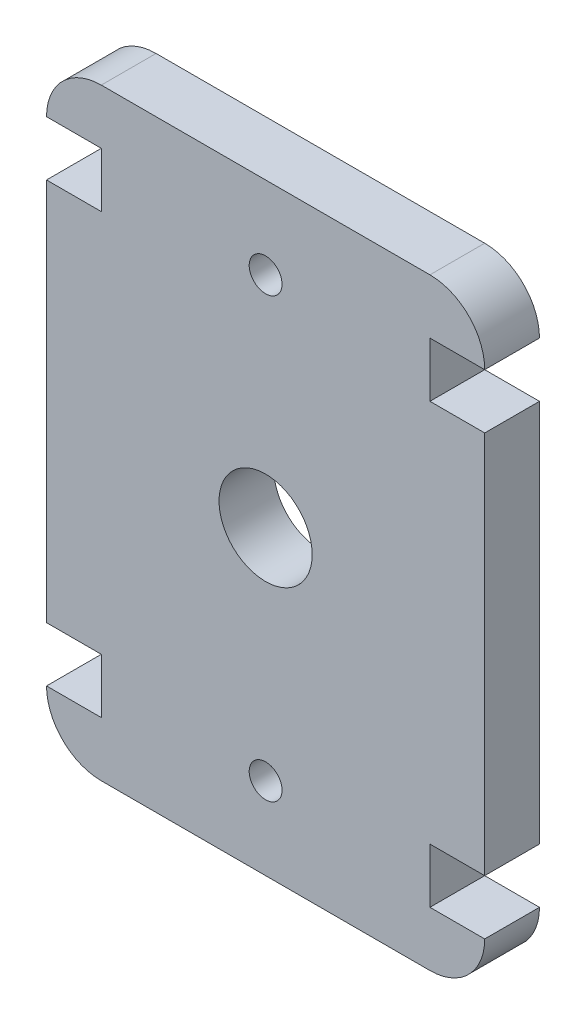
ISO-10303-21;
HEADER;
FILE_DESCRIPTION(('STEP AP214'),'2;1');
FILE_NAME('part.step','',(''),(''),'','','');
FILE_SCHEMA(('AUTOMOTIVE_DESIGN { 1 0 10303 214 1 1 1 1 }'));
ENDSEC;
DATA;
#1=APPLICATION_CONTEXT('core data for automotive mechanical design processes');
#2=APPLICATION_PROTOCOL_DEFINITION('international standard','automotive_design',2000,#1);
#3=PRODUCT_CONTEXT('',#1,'mechanical');
#4=PRODUCT('Part','Part','',(#3));
#5=PRODUCT_RELATED_PRODUCT_CATEGORY('part','',(#4));
#6=PRODUCT_DEFINITION_FORMATION('','',#4);
#7=PRODUCT_DEFINITION_CONTEXT('part definition',#1,'design');
#8=PRODUCT_DEFINITION('design','',#6,#7);
#9=PRODUCT_DEFINITION_SHAPE('','',#8);
#10=(LENGTH_UNIT() NAMED_UNIT(*) SI_UNIT(.MILLI.,.METRE.));
#11=(NAMED_UNIT(*) PLANE_ANGLE_UNIT() SI_UNIT($,.RADIAN.));
#12=(NAMED_UNIT(*) SI_UNIT($,.STERADIAN.) SOLID_ANGLE_UNIT());
#13=UNCERTAINTY_MEASURE_WITH_UNIT(LENGTH_MEASURE(1.E-05),#10,'distance_accuracy_value','');
#14=(GEOMETRIC_REPRESENTATION_CONTEXT(3) GLOBAL_UNCERTAINTY_ASSIGNED_CONTEXT((#13)) GLOBAL_UNIT_ASSIGNED_CONTEXT((#10,
#11,#12)) REPRESENTATION_CONTEXT('',''));
#15=CARTESIAN_POINT('',(0.,0.,0.));
#16=DIRECTION('',(0.,0.,1.));
#17=DIRECTION('',(1.,0.,0.));
#18=AXIS2_PLACEMENT_3D('',#15,#16,#17);
#19=CARTESIAN_POINT('',(0.,0.,5.));
#20=DIRECTION('',(0.,0.,1.));
#21=DIRECTION('',(1.,0.,0.));
#22=AXIS2_PLACEMENT_3D('',#19,#20,#21);
#23=PLANE('',#22);
#24=CARTESIAN_POINT('',(0.,7.5,5.));
#25=DIRECTION('',(0.,0.,1.));
#26=DIRECTION('',(1.,0.,0.));
#27=AXIS2_PLACEMENT_3D('',#24,#25,#26);
#28=CIRCLE('',#27,1.5);
#29=CARTESIAN_POINT('',(1.5,7.5,5.));
#30=VERTEX_POINT('',#29);
#31=EDGE_CURVE('E473',#30,#30,#28,.T.);
#32=ORIENTED_EDGE('',*,*,#31,.F.);
#33=EDGE_LOOP('',(#32));
#34=FACE_BOUND('',#33,.T.);
#35=DIRECTION('',(1.,0.,0.));
#36=VECTOR('',#35,1.);
#37=CARTESIAN_POINT('',(15.,50.,5.));
#38=LINE('',#37,#36);
#39=CARTESIAN_POINT('',(15.,50.,5.));
#40=VERTEX_POINT('',#39);
#41=CARTESIAN_POINT('',(20.,50.,5.));
#42=VERTEX_POINT('',#41);
#43=EDGE_CURVE('E325',#40,#42,#38,.T.);
#44=ORIENTED_EDGE('',*,*,#43,.T.);
#45=CARTESIAN_POINT('',(15.,50.0000000000001,5.));
#46=DIRECTION('',(0.,0.,1.));
#47=DIRECTION('',(1.,0.,0.));
#48=AXIS2_PLACEMENT_3D('',#45,#46,#47);
#49=CIRCLE('',#48,5.);
#50=CARTESIAN_POINT('',(15.,55.0000000000001,5.));
#51=VERTEX_POINT('',#50);
#52=EDGE_CURVE('E174',#42,#51,#49,.T.);
#53=ORIENTED_EDGE('',*,*,#52,.T.);
#54=DIRECTION('',(-1.,0.,0.));
#55=VECTOR('',#54,1.);
#56=CARTESIAN_POINT('',(20.,55.0000000000001,5.));
#57=LINE('',#56,#55);
#58=CARTESIAN_POINT('',(-15.,55.0000000000001,5.));
#59=VERTEX_POINT('',#58);
#60=EDGE_CURVE('E331',#51,#59,#57,.T.);
#61=ORIENTED_EDGE('',*,*,#60,.T.);
#62=CARTESIAN_POINT('',(-15.,50.0000000000001,5.));
#63=DIRECTION('',(0.,0.,1.));
#64=DIRECTION('',(1.,0.,0.));
#65=AXIS2_PLACEMENT_3D('',#62,#63,#64);
#66=CIRCLE('',#65,5.);
#67=CARTESIAN_POINT('',(-20.,50.,5.));
#68=VERTEX_POINT('',#67);
#69=EDGE_CURVE('E205',#59,#68,#66,.T.);
#70=ORIENTED_EDGE('',*,*,#69,.T.);
#71=DIRECTION('',(1.,0.,0.));
#72=VECTOR('',#71,1.);
#73=CARTESIAN_POINT('',(-20.,50.,5.));
#74=LINE('',#73,#72);
#75=CARTESIAN_POINT('',(-15.,50.,5.));
#76=VERTEX_POINT('',#75);
#77=EDGE_CURVE('E334',#68,#76,#74,.T.);
#78=ORIENTED_EDGE('',*,*,#77,.T.);
#79=DIRECTION('',(0.,-1.,0.));
#80=VECTOR('',#79,1.);
#81=CARTESIAN_POINT('',(-15.,50.,5.));
#82=LINE('',#81,#80);
#83=CARTESIAN_POINT('',(-15.,45.,5.));
#84=VERTEX_POINT('',#83);
#85=EDGE_CURVE('E336',#76,#84,#82,.T.);
#86=ORIENTED_EDGE('',*,*,#85,.T.);
#87=DIRECTION('',(-1.,0.,0.));
#88=VECTOR('',#87,1.);
#89=CARTESIAN_POINT('',(-15.,45.,5.));
#90=LINE('',#89,#88);
#91=CARTESIAN_POINT('',(-20.,45.,5.));
#92=VERTEX_POINT('',#91);
#93=EDGE_CURVE('E338',#84,#92,#90,.T.);
#94=ORIENTED_EDGE('',*,*,#93,.T.);
#95=DIRECTION('',(0.,-1.,0.));
#96=VECTOR('',#95,1.);
#97=CARTESIAN_POINT('',(-20.,45.,5.));
#98=LINE('',#97,#96);
#99=CARTESIAN_POINT('',(-20.,10.0000000000001,5.));
#100=VERTEX_POINT('',#99);
#101=EDGE_CURVE('E340',#92,#100,#98,.T.);
#102=ORIENTED_EDGE('',*,*,#101,.T.);
#103=DIRECTION('',(1.,0.,0.));
#104=VECTOR('',#103,1.);
#105=CARTESIAN_POINT('',(-20.,10.0000000000001,5.));
#106=LINE('',#105,#104);
#107=CARTESIAN_POINT('',(-15.,10.,5.));
#108=VERTEX_POINT('',#107);
#109=EDGE_CURVE('E342',#100,#108,#106,.T.);
#110=ORIENTED_EDGE('',*,*,#109,.T.);
#111=DIRECTION('',(0.,-1.,0.));
#112=VECTOR('',#111,1.);
#113=CARTESIAN_POINT('',(-15.,10.,5.));
#114=LINE('',#113,#112);
#115=CARTESIAN_POINT('',(-15.,5.,5.));
#116=VERTEX_POINT('',#115);
#117=EDGE_CURVE('E343',#108,#116,#114,.T.);
#118=ORIENTED_EDGE('',*,*,#117,.T.);
#119=DIRECTION('',(-1.,0.,0.));
#120=VECTOR('',#119,1.);
#121=CARTESIAN_POINT('',(-15.,5.,5.));
#122=LINE('',#121,#120);
#123=CARTESIAN_POINT('',(-20.,5.00000000000009,5.));
#124=VERTEX_POINT('',#123);
#125=EDGE_CURVE('E229',#116,#124,#122,.T.);
#126=ORIENTED_EDGE('',*,*,#125,.T.);
#127=CARTESIAN_POINT('',(-15.,5.,5.));
#128=DIRECTION('',(0.,0.,1.));
#129=DIRECTION('',(1.,0.,0.));
#130=AXIS2_PLACEMENT_3D('',#127,#128,#129);
#131=CIRCLE('',#130,5.);
#132=CARTESIAN_POINT('',(-15.,0.,5.));
#133=VERTEX_POINT('',#132);
#134=EDGE_CURVE('E52',#124,#133,#131,.T.);
#135=ORIENTED_EDGE('',*,*,#134,.T.);
#136=DIRECTION('',(1.,0.,0.));
#137=VECTOR('',#136,1.);
#138=CARTESIAN_POINT('',(-20.,0.,5.));
#139=LINE('',#138,#137);
#140=CARTESIAN_POINT('',(15.,0.,5.));
#141=VERTEX_POINT('',#140);
#142=EDGE_CURVE('E171',#133,#141,#139,.T.);
#143=ORIENTED_EDGE('',*,*,#142,.T.);
#144=CARTESIAN_POINT('',(15.,5.,5.));
#145=DIRECTION('',(0.,0.,1.));
#146=DIRECTION('',(1.,0.,0.));
#147=AXIS2_PLACEMENT_3D('',#144,#145,#146);
#148=CIRCLE('',#147,5.);
#149=CARTESIAN_POINT('',(20.,5.0000000000001,5.));
#150=VERTEX_POINT('',#149);
#151=EDGE_CURVE('E166',#141,#150,#148,.T.);
#152=ORIENTED_EDGE('',*,*,#151,.T.);
#153=DIRECTION('',(-1.,0.,0.));
#154=VECTOR('',#153,1.);
#155=CARTESIAN_POINT('',(20.,5.0000000000001,5.));
#156=LINE('',#155,#154);
#157=CARTESIAN_POINT('',(15.,5.,5.));
#158=VERTEX_POINT('',#157);
#159=EDGE_CURVE('E169',#150,#158,#156,.T.);
#160=ORIENTED_EDGE('',*,*,#159,.T.);
#161=DIRECTION('',(0.,1.,0.));
#162=VECTOR('',#161,1.);
#163=CARTESIAN_POINT('',(15.,5.,5.));
#164=LINE('',#163,#162);
#165=CARTESIAN_POINT('',(15.,10.,5.));
#166=VERTEX_POINT('',#165);
#167=EDGE_CURVE('E184',#158,#166,#164,.T.);
#168=ORIENTED_EDGE('',*,*,#167,.T.);
#169=DIRECTION('',(1.,0.,0.));
#170=VECTOR('',#169,1.);
#171=CARTESIAN_POINT('',(15.,10.,5.));
#172=LINE('',#171,#170);
#173=CARTESIAN_POINT('',(20.,10.0000000000001,5.));
#174=VERTEX_POINT('',#173);
#175=EDGE_CURVE('E306',#166,#174,#172,.T.);
#176=ORIENTED_EDGE('',*,*,#175,.T.);
#177=DIRECTION('',(0.,1.,0.));
#178=VECTOR('',#177,1.);
#179=CARTESIAN_POINT('',(20.,10.0000000000001,5.));
#180=LINE('',#179,#178);
#181=CARTESIAN_POINT('',(20.,45.,5.));
#182=VERTEX_POINT('',#181);
#183=EDGE_CURVE('E323',#174,#182,#180,.T.);
#184=ORIENTED_EDGE('',*,*,#183,.T.);
#185=DIRECTION('',(-1.,0.,0.));
#186=VECTOR('',#185,1.);
#187=CARTESIAN_POINT('',(20.,45.,5.));
#188=LINE('',#187,#186);
#189=CARTESIAN_POINT('',(15.,45.,5.));
#190=VERTEX_POINT('',#189);
#191=EDGE_CURVE('E320',#182,#190,#188,.T.);
#192=ORIENTED_EDGE('',*,*,#191,.T.);
#193=DIRECTION('',(0.,1.,0.));
#194=VECTOR('',#193,1.);
#195=CARTESIAN_POINT('',(15.,45.,5.));
#196=LINE('',#195,#194);
#197=EDGE_CURVE('E322',#190,#40,#196,.T.);
#198=ORIENTED_EDGE('',*,*,#197,.T.);
#199=EDGE_LOOP('',(#44,#53,#61,#70,#78,#86,#94,#102,#110,#118,#126,#135,#143,#152,#160,#168,
#176,#184,#192,#198));
#200=FACE_BOUND('',#199,.T.);
#201=CARTESIAN_POINT('',(0.,47.5000000000001,5.));
#202=DIRECTION('',(0.,0.,1.));
#203=DIRECTION('',(1.,0.,0.));
#204=AXIS2_PLACEMENT_3D('',#201,#202,#203);
#205=CIRCLE('',#204,1.5);
#206=CARTESIAN_POINT('',(1.5,47.5000000000001,5.));
#207=VERTEX_POINT('',#206);
#208=EDGE_CURVE('E221',#207,#207,#205,.T.);
#209=ORIENTED_EDGE('',*,*,#208,.F.);
#210=EDGE_LOOP('',(#209));
#211=FACE_BOUND('',#210,.T.);
#212=CARTESIAN_POINT('',(0.,27.5000000000001,5.));
#213=DIRECTION('',(0.,0.,1.));
#214=DIRECTION('',(1.,0.,0.));
#215=AXIS2_PLACEMENT_3D('',#212,#213,#214);
#216=CIRCLE('',#215,4.25);
#217=CARTESIAN_POINT('',(4.25,27.5000000000001,5.));
#218=VERTEX_POINT('',#217);
#219=EDGE_CURVE('E464',#218,#218,#216,.T.);
#220=ORIENTED_EDGE('',*,*,#219,.F.);
#221=EDGE_LOOP('',(#220));
#222=FACE_BOUND('',#221,.T.);
#223=ADVANCED_FACE('F32',(#34,#200,#211,#222),#23,.T.);
#224=CARTESIAN_POINT('',(0.,0.,0.));
#225=DIRECTION('',(0.,0.,1.));
#226=DIRECTION('',(1.,0.,0.));
#227=AXIS2_PLACEMENT_3D('',#224,#225,#226);
#228=PLANE('',#227);
#229=DIRECTION('',(-1.,0.,0.));
#230=VECTOR('',#229,1.);
#231=CARTESIAN_POINT('',(20.,55.0000000000001,0.));
#232=LINE('',#231,#230);
#233=CARTESIAN_POINT('',(15.,55.0000000000001,0.));
#234=VERTEX_POINT('',#233);
#235=CARTESIAN_POINT('',(-15.,55.0000000000001,0.));
#236=VERTEX_POINT('',#235);
#237=EDGE_CURVE('E244',#234,#236,#232,.T.);
#238=ORIENTED_EDGE('',*,*,#237,.F.);
#239=CARTESIAN_POINT('',(15.,50.0000000000001,0.));
#240=DIRECTION('',(0.,0.,1.));
#241=DIRECTION('',(1.,0.,0.));
#242=AXIS2_PLACEMENT_3D('',#239,#240,#241);
#243=CIRCLE('',#242,5.);
#244=CARTESIAN_POINT('',(20.,50.,0.));
#245=VERTEX_POINT('',#244);
#246=EDGE_CURVE('E203',#234,#245,#243,.F.);
#247=ORIENTED_EDGE('',*,*,#246,.T.);
#248=DIRECTION('',(1.,0.,0.));
#249=VECTOR('',#248,1.);
#250=CARTESIAN_POINT('',(15.,50.,0.));
#251=LINE('',#250,#249);
#252=CARTESIAN_POINT('',(15.,50.,0.));
#253=VERTEX_POINT('',#252);
#254=EDGE_CURVE('E241',#253,#245,#251,.T.);
#255=ORIENTED_EDGE('',*,*,#254,.F.);
#256=DIRECTION('',(0.,1.,0.));
#257=VECTOR('',#256,1.);
#258=CARTESIAN_POINT('',(15.,45.,0.));
#259=LINE('',#258,#257);
#260=CARTESIAN_POINT('',(15.,45.,0.));
#261=VERTEX_POINT('',#260);
#262=EDGE_CURVE('E239',#261,#253,#259,.T.);
#263=ORIENTED_EDGE('',*,*,#262,.F.);
#264=DIRECTION('',(-1.,0.,0.));
#265=VECTOR('',#264,1.);
#266=CARTESIAN_POINT('',(20.,45.,0.));
#267=LINE('',#266,#265);
#268=CARTESIAN_POINT('',(20.,45.,0.));
#269=VERTEX_POINT('',#268);
#270=EDGE_CURVE('E237',#269,#261,#267,.T.);
#271=ORIENTED_EDGE('',*,*,#270,.F.);
#272=DIRECTION('',(0.,1.,0.));
#273=VECTOR('',#272,1.);
#274=CARTESIAN_POINT('',(20.,10.0000000000001,0.));
#275=LINE('',#274,#273);
#276=CARTESIAN_POINT('',(20.,10.0000000000001,0.));
#277=VERTEX_POINT('',#276);
#278=EDGE_CURVE('E235',#277,#269,#275,.T.);
#279=ORIENTED_EDGE('',*,*,#278,.F.);
#280=DIRECTION('',(1.,0.,0.));
#281=VECTOR('',#280,1.);
#282=CARTESIAN_POINT('',(15.,10.,0.));
#283=LINE('',#282,#281);
#284=CARTESIAN_POINT('',(15.,10.,0.));
#285=VERTEX_POINT('',#284);
#286=EDGE_CURVE('E233',#285,#277,#283,.T.);
#287=ORIENTED_EDGE('',*,*,#286,.F.);
#288=DIRECTION('',(0.,1.,0.));
#289=VECTOR('',#288,1.);
#290=CARTESIAN_POINT('',(15.,5.,0.));
#291=LINE('',#290,#289);
#292=CARTESIAN_POINT('',(15.,5.,0.));
#293=VERTEX_POINT('',#292);
#294=EDGE_CURVE('E223',#293,#285,#291,.T.);
#295=ORIENTED_EDGE('',*,*,#294,.F.);
#296=DIRECTION('',(-1.,0.,0.));
#297=VECTOR('',#296,1.);
#298=CARTESIAN_POINT('',(20.,5.0000000000001,0.));
#299=LINE('',#298,#297);
#300=CARTESIAN_POINT('',(20.,5.0000000000001,0.));
#301=VERTEX_POINT('',#300);
#302=EDGE_CURVE('E220',#301,#293,#299,.T.);
#303=ORIENTED_EDGE('',*,*,#302,.F.);
#304=CARTESIAN_POINT('',(15.,5.,0.));
#305=DIRECTION('',(0.,0.,1.));
#306=DIRECTION('',(1.,0.,0.));
#307=AXIS2_PLACEMENT_3D('',#304,#305,#306);
#308=CIRCLE('',#307,5.);
#309=CARTESIAN_POINT('',(15.,0.,0.));
#310=VERTEX_POINT('',#309);
#311=EDGE_CURVE('E187',#301,#310,#308,.F.);
#312=ORIENTED_EDGE('',*,*,#311,.T.);
#313=DIRECTION('',(1.,0.,0.));
#314=VECTOR('',#313,1.);
#315=CARTESIAN_POINT('',(-20.,0.,0.));
#316=LINE('',#315,#314);
#317=CARTESIAN_POINT('',(-15.,0.,0.));
#318=VERTEX_POINT('',#317);
#319=EDGE_CURVE('E212',#318,#310,#316,.T.);
#320=ORIENTED_EDGE('',*,*,#319,.F.);
#321=CARTESIAN_POINT('',(-15.,5.,0.));
#322=DIRECTION('',(0.,0.,1.));
#323=DIRECTION('',(1.,0.,0.));
#324=AXIS2_PLACEMENT_3D('',#321,#322,#323);
#325=CIRCLE('',#324,5.);
#326=CARTESIAN_POINT('',(-20.,5.00000000000009,0.));
#327=VERTEX_POINT('',#326);
#328=EDGE_CURVE('E200',#318,#327,#325,.F.);
#329=ORIENTED_EDGE('',*,*,#328,.T.);
#330=DIRECTION('',(-1.,0.,0.));
#331=VECTOR('',#330,1.);
#332=CARTESIAN_POINT('',(-15.,5.,0.));
#333=LINE('',#332,#331);
#334=CARTESIAN_POINT('',(-15.,5.,0.));
#335=VERTEX_POINT('',#334);
#336=EDGE_CURVE('E259',#335,#327,#333,.T.);
#337=ORIENTED_EDGE('',*,*,#336,.F.);
#338=DIRECTION('',(0.,-1.,0.));
#339=VECTOR('',#338,1.);
#340=CARTESIAN_POINT('',(-15.,10.,0.));
#341=LINE('',#340,#339);
#342=CARTESIAN_POINT('',(-15.,10.,0.));
#343=VERTEX_POINT('',#342);
#344=EDGE_CURVE('E257',#343,#335,#341,.T.);
#345=ORIENTED_EDGE('',*,*,#344,.F.);
#346=DIRECTION('',(1.,0.,0.));
#347=VECTOR('',#346,1.);
#348=CARTESIAN_POINT('',(-20.,10.0000000000001,0.));
#349=LINE('',#348,#347);
#350=CARTESIAN_POINT('',(-20.,10.0000000000001,0.));
#351=VERTEX_POINT('',#350);
#352=EDGE_CURVE('E255',#351,#343,#349,.T.);
#353=ORIENTED_EDGE('',*,*,#352,.F.);
#354=DIRECTION('',(0.,-1.,0.));
#355=VECTOR('',#354,1.);
#356=CARTESIAN_POINT('',(-20.,45.,0.));
#357=LINE('',#356,#355);
#358=CARTESIAN_POINT('',(-20.,45.,0.));
#359=VERTEX_POINT('',#358);
#360=EDGE_CURVE('E253',#359,#351,#357,.T.);
#361=ORIENTED_EDGE('',*,*,#360,.F.);
#362=DIRECTION('',(-1.,0.,0.));
#363=VECTOR('',#362,1.);
#364=CARTESIAN_POINT('',(-15.,45.,0.));
#365=LINE('',#364,#363);
#366=CARTESIAN_POINT('',(-15.,45.,0.));
#367=VERTEX_POINT('',#366);
#368=EDGE_CURVE('E251',#367,#359,#365,.T.);
#369=ORIENTED_EDGE('',*,*,#368,.F.);
#370=DIRECTION('',(0.,-1.,0.));
#371=VECTOR('',#370,1.);
#372=CARTESIAN_POINT('',(-15.,50.,0.));
#373=LINE('',#372,#371);
#374=CARTESIAN_POINT('',(-15.,50.,0.));
#375=VERTEX_POINT('',#374);
#376=EDGE_CURVE('E249',#375,#367,#373,.T.);
#377=ORIENTED_EDGE('',*,*,#376,.F.);
#378=DIRECTION('',(1.,0.,0.));
#379=VECTOR('',#378,1.);
#380=CARTESIAN_POINT('',(-20.,50.,0.));
#381=LINE('',#380,#379);
#382=CARTESIAN_POINT('',(-20.,50.,0.));
#383=VERTEX_POINT('',#382);
#384=EDGE_CURVE('E247',#383,#375,#381,.T.);
#385=ORIENTED_EDGE('',*,*,#384,.F.);
#386=CARTESIAN_POINT('',(-15.,50.0000000000001,0.));
#387=DIRECTION('',(0.,0.,1.));
#388=DIRECTION('',(1.,0.,0.));
#389=AXIS2_PLACEMENT_3D('',#386,#387,#388);
#390=CIRCLE('',#389,5.);
#391=EDGE_CURVE('E198',#383,#236,#390,.F.);
#392=ORIENTED_EDGE('',*,*,#391,.T.);
#393=EDGE_LOOP('',(#238,#247,#255,#263,#271,#279,#287,#295,#303,#312,#320,#329,#337,#345,#353,
#361,#369,#377,#385,#392));
#394=FACE_BOUND('',#393,.T.);
#395=CARTESIAN_POINT('',(0.,47.5000000000001,0.));
#396=DIRECTION('',(0.,0.,1.));
#397=DIRECTION('',(1.,0.,0.));
#398=AXIS2_PLACEMENT_3D('',#395,#396,#397);
#399=CIRCLE('',#398,1.5);
#400=CARTESIAN_POINT('',(1.5,47.5000000000001,0.));
#401=VERTEX_POINT('',#400);
#402=EDGE_CURVE('E226',#401,#401,#399,.T.);
#403=ORIENTED_EDGE('',*,*,#402,.T.);
#404=EDGE_LOOP('',(#403));
#405=FACE_BOUND('',#404,.T.);
#406=CARTESIAN_POINT('',(0.,7.5,0.));
#407=DIRECTION('',(0.,0.,1.));
#408=DIRECTION('',(1.,0.,0.));
#409=AXIS2_PLACEMENT_3D('',#406,#407,#408);
#410=CIRCLE('',#409,1.5);
#411=CARTESIAN_POINT('',(1.5,7.5,0.));
#412=VERTEX_POINT('',#411);
#413=EDGE_CURVE('E470',#412,#412,#410,.T.);
#414=ORIENTED_EDGE('',*,*,#413,.T.);
#415=EDGE_LOOP('',(#414));
#416=FACE_BOUND('',#415,.T.);
#417=CARTESIAN_POINT('',(0.,27.5000000000001,0.));
#418=DIRECTION('',(0.,0.,1.));
#419=DIRECTION('',(1.,0.,0.));
#420=AXIS2_PLACEMENT_3D('',#417,#418,#419);
#421=CIRCLE('',#420,4.25);
#422=CARTESIAN_POINT('',(4.25,27.5000000000001,0.));
#423=VERTEX_POINT('',#422);
#424=EDGE_CURVE('E467',#423,#423,#421,.T.);
#425=ORIENTED_EDGE('',*,*,#424,.T.);
#426=EDGE_LOOP('',(#425));
#427=FACE_BOUND('',#426,.T.);
#428=ADVANCED_FACE('F216',(#394,#405,#416,#427),#228,.F.);
#429=CARTESIAN_POINT('',(-20.,0.,5.));
#430=DIRECTION('',(0.,1.,0.));
#431=DIRECTION('',(0.,0.,1.));
#432=AXIS2_PLACEMENT_3D('',#429,#430,#431);
#433=PLANE('',#432);
#434=ORIENTED_EDGE('',*,*,#319,.T.);
#435=DIRECTION('',(0.,0.,-1.));
#436=VECTOR('',#435,1.);
#437=CARTESIAN_POINT('',(15.,0.,5.));
#438=LINE('',#437,#436);
#439=EDGE_CURVE('E11',#310,#141,#438,.F.);
#440=ORIENTED_EDGE('',*,*,#439,.T.);
#441=ORIENTED_EDGE('',*,*,#142,.F.);
#442=DIRECTION('',(0.,0.,-1.));
#443=VECTOR('',#442,1.);
#444=CARTESIAN_POINT('',(-15.,0.,5.));
#445=LINE('',#444,#443);
#446=EDGE_CURVE('E40',#133,#318,#445,.T.);
#447=ORIENTED_EDGE('',*,*,#446,.T.);
#448=EDGE_LOOP('',(#434,#440,#441,#447));
#449=FACE_BOUND('',#448,.T.);
#450=ADVANCED_FACE('F211',(#449),#433,.F.);
#451=CARTESIAN_POINT('',(20.,5.0000000000001,5.));
#452=DIRECTION('',(0.,-1.,0.));
#453=DIRECTION('',(1.,0.,0.));
#454=AXIS2_PLACEMENT_3D('',#451,#452,#453);
#455=PLANE('',#454);
#456=ORIENTED_EDGE('',*,*,#302,.T.);
#457=DIRECTION('',(0.,0.,-1.));
#458=VECTOR('',#457,1.);
#459=CARTESIAN_POINT('',(15.,5.,5.));
#460=LINE('',#459,#458);
#461=EDGE_CURVE('E182',#158,#293,#460,.T.);
#462=ORIENTED_EDGE('',*,*,#461,.F.);
#463=ORIENTED_EDGE('',*,*,#159,.F.);
#464=DIRECTION('',(0.,0.,-1.));
#465=VECTOR('',#464,1.);
#466=CARTESIAN_POINT('',(20.,5.0000000000001,5.));
#467=LINE('',#466,#465);
#468=EDGE_CURVE('E179',#150,#301,#467,.T.);
#469=ORIENTED_EDGE('',*,*,#468,.T.);
#470=EDGE_LOOP('',(#456,#462,#463,#469));
#471=FACE_BOUND('',#470,.T.);
#472=ADVANCED_FACE('F178',(#471),#455,.F.);
#473=CARTESIAN_POINT('',(15.,5.,5.));
#474=DIRECTION('',(-1.,0.,0.));
#475=DIRECTION('',(0.,0.,1.));
#476=AXIS2_PLACEMENT_3D('',#473,#474,#475);
#477=PLANE('',#476);
#478=ORIENTED_EDGE('',*,*,#294,.T.);
#479=DIRECTION('',(0.,0.,-1.));
#480=VECTOR('',#479,1.);
#481=CARTESIAN_POINT('',(15.,10.,5.));
#482=LINE('',#481,#480);
#483=EDGE_CURVE('E192',#166,#285,#482,.T.);
#484=ORIENTED_EDGE('',*,*,#483,.F.);
#485=ORIENTED_EDGE('',*,*,#167,.F.);
#486=ORIENTED_EDGE('',*,*,#461,.T.);
#487=EDGE_LOOP('',(#478,#484,#485,#486));
#488=FACE_BOUND('',#487,.T.);
#489=ADVANCED_FACE('F415',(#488),#477,.F.);
#490=CARTESIAN_POINT('',(15.,10.,5.));
#491=DIRECTION('',(0.,1.,0.));
#492=DIRECTION('',(-1.,0.,0.));
#493=AXIS2_PLACEMENT_3D('',#490,#491,#492);
#494=PLANE('',#493);
#495=ORIENTED_EDGE('',*,*,#286,.T.);
#496=DIRECTION('',(0.,0.,-1.));
#497=VECTOR('',#496,1.);
#498=CARTESIAN_POINT('',(20.,10.0000000000001,5.));
#499=LINE('',#498,#497);
#500=EDGE_CURVE('E297',#174,#277,#499,.T.);
#501=ORIENTED_EDGE('',*,*,#500,.F.);
#502=ORIENTED_EDGE('',*,*,#175,.F.);
#503=ORIENTED_EDGE('',*,*,#483,.T.);
#504=EDGE_LOOP('',(#495,#501,#502,#503));
#505=FACE_BOUND('',#504,.T.);
#506=ADVANCED_FACE('F304',(#505),#494,.F.);
#507=CARTESIAN_POINT('',(20.,10.0000000000001,5.));
#508=DIRECTION('',(-1.,0.,0.));
#509=DIRECTION('',(0.,0.,1.));
#510=AXIS2_PLACEMENT_3D('',#507,#508,#509);
#511=PLANE('',#510);
#512=ORIENTED_EDGE('',*,*,#278,.T.);
#513=DIRECTION('',(0.,0.,-1.));
#514=VECTOR('',#513,1.);
#515=CARTESIAN_POINT('',(20.,45.,5.));
#516=LINE('',#515,#514);
#517=EDGE_CURVE('E294',#182,#269,#516,.T.);
#518=ORIENTED_EDGE('',*,*,#517,.F.);
#519=ORIENTED_EDGE('',*,*,#183,.F.);
#520=ORIENTED_EDGE('',*,*,#500,.T.);
#521=EDGE_LOOP('',(#512,#518,#519,#520));
#522=FACE_BOUND('',#521,.T.);
#523=ADVANCED_FACE('F314',(#522),#511,.F.);
#524=CARTESIAN_POINT('',(20.,45.,5.));
#525=DIRECTION('',(0.,-1.,0.));
#526=DIRECTION('',(0.,0.,-1.));
#527=AXIS2_PLACEMENT_3D('',#524,#525,#526);
#528=PLANE('',#527);
#529=ORIENTED_EDGE('',*,*,#270,.T.);
#530=DIRECTION('',(0.,0.,-1.));
#531=VECTOR('',#530,1.);
#532=CARTESIAN_POINT('',(15.,45.,5.));
#533=LINE('',#532,#531);
#534=EDGE_CURVE('E291',#190,#261,#533,.T.);
#535=ORIENTED_EDGE('',*,*,#534,.F.);
#536=ORIENTED_EDGE('',*,*,#191,.F.);
#537=ORIENTED_EDGE('',*,*,#517,.T.);
#538=EDGE_LOOP('',(#529,#535,#536,#537));
#539=FACE_BOUND('',#538,.T.);
#540=ADVANCED_FACE('F318',(#539),#528,.F.);
#541=CARTESIAN_POINT('',(15.,45.,5.));
#542=DIRECTION('',(-1.,0.,0.));
#543=DIRECTION('',(0.,0.,1.));
#544=AXIS2_PLACEMENT_3D('',#541,#542,#543);
#545=PLANE('',#544);
#546=ORIENTED_EDGE('',*,*,#262,.T.);
#547=DIRECTION('',(0.,0.,-1.));
#548=VECTOR('',#547,1.);
#549=CARTESIAN_POINT('',(15.,50.,5.));
#550=LINE('',#549,#548);
#551=EDGE_CURVE('E288',#40,#253,#550,.T.);
#552=ORIENTED_EDGE('',*,*,#551,.F.);
#553=ORIENTED_EDGE('',*,*,#197,.F.);
#554=ORIENTED_EDGE('',*,*,#534,.T.);
#555=EDGE_LOOP('',(#546,#552,#553,#554));
#556=FACE_BOUND('',#555,.T.);
#557=ADVANCED_FACE('F404',(#556),#545,.F.);
#558=CARTESIAN_POINT('',(15.,50.,5.));
#559=DIRECTION('',(0.,1.,0.));
#560=DIRECTION('',(-1.,0.,0.));
#561=AXIS2_PLACEMENT_3D('',#558,#559,#560);
#562=PLANE('',#561);
#563=ORIENTED_EDGE('',*,*,#254,.T.);
#564=DIRECTION('',(0.,0.,-1.));
#565=VECTOR('',#564,1.);
#566=CARTESIAN_POINT('',(20.,50.,5.));
#567=LINE('',#566,#565);
#568=EDGE_CURVE('E285',#42,#245,#567,.T.);
#569=ORIENTED_EDGE('',*,*,#568,.F.);
#570=ORIENTED_EDGE('',*,*,#43,.F.);
#571=ORIENTED_EDGE('',*,*,#551,.T.);
#572=EDGE_LOOP('',(#563,#569,#570,#571));
#573=FACE_BOUND('',#572,.T.);
#574=ADVANCED_FACE('F400',(#573),#562,.F.);
#575=CARTESIAN_POINT('',(20.,55.0000000000001,5.));
#576=DIRECTION('',(0.,-1.,0.));
#577=DIRECTION('',(0.,0.,-1.));
#578=AXIS2_PLACEMENT_3D('',#575,#576,#577);
#579=PLANE('',#578);
#580=ORIENTED_EDGE('',*,*,#60,.F.);
#581=DIRECTION('',(0.,0.,-1.));
#582=VECTOR('',#581,1.);
#583=CARTESIAN_POINT('',(15.,55.0000000000001,5.));
#584=LINE('',#583,#582);
#585=EDGE_CURVE('E190',#51,#234,#584,.T.);
#586=ORIENTED_EDGE('',*,*,#585,.T.);
#587=ORIENTED_EDGE('',*,*,#237,.T.);
#588=DIRECTION('',(0.,0.,-1.));
#589=VECTOR('',#588,1.);
#590=CARTESIAN_POINT('',(-15.,55.0000000000001,5.));
#591=LINE('',#590,#589);
#592=EDGE_CURVE('E188',#236,#59,#591,.F.);
#593=ORIENTED_EDGE('',*,*,#592,.T.);
#594=EDGE_LOOP('',(#580,#586,#587,#593));
#595=FACE_BOUND('',#594,.T.);
#596=ADVANCED_FACE('F396',(#595),#579,.F.);
#597=CARTESIAN_POINT('',(-20.,50.,5.));
#598=DIRECTION('',(0.,1.,0.));
#599=DIRECTION('',(-1.,0.,0.));
#600=AXIS2_PLACEMENT_3D('',#597,#598,#599);
#601=PLANE('',#600);
#602=ORIENTED_EDGE('',*,*,#384,.T.);
#603=DIRECTION('',(0.,0.,-1.));
#604=VECTOR('',#603,1.);
#605=CARTESIAN_POINT('',(-15.,50.,5.));
#606=LINE('',#605,#604);
#607=EDGE_CURVE('E279',#76,#375,#606,.T.);
#608=ORIENTED_EDGE('',*,*,#607,.F.);
#609=ORIENTED_EDGE('',*,*,#77,.F.);
#610=DIRECTION('',(0.,0.,-1.));
#611=VECTOR('',#610,1.);
#612=CARTESIAN_POINT('',(-20.,50.,5.));
#613=LINE('',#612,#611);
#614=EDGE_CURVE('E282',#68,#383,#613,.T.);
#615=ORIENTED_EDGE('',*,*,#614,.T.);
#616=EDGE_LOOP('',(#602,#608,#609,#615));
#617=FACE_BOUND('',#616,.T.);
#618=ADVANCED_FACE('F392',(#617),#601,.F.);
#619=CARTESIAN_POINT('',(-15.,50.,5.));
#620=DIRECTION('',(1.,0.,0.));
#621=DIRECTION('',(0.,0.,-1.));
#622=AXIS2_PLACEMENT_3D('',#619,#620,#621);
#623=PLANE('',#622);
#624=ORIENTED_EDGE('',*,*,#376,.T.);
#625=DIRECTION('',(0.,0.,-1.));
#626=VECTOR('',#625,1.);
#627=CARTESIAN_POINT('',(-15.,45.,5.));
#628=LINE('',#627,#626);
#629=EDGE_CURVE('E276',#84,#367,#628,.T.);
#630=ORIENTED_EDGE('',*,*,#629,.F.);
#631=ORIENTED_EDGE('',*,*,#85,.F.);
#632=ORIENTED_EDGE('',*,*,#607,.T.);
#633=EDGE_LOOP('',(#624,#630,#631,#632));
#634=FACE_BOUND('',#633,.T.);
#635=ADVANCED_FACE('F388',(#634),#623,.F.);
#636=CARTESIAN_POINT('',(-15.,45.,5.));
#637=DIRECTION('',(0.,-1.,0.));
#638=DIRECTION('',(0.,0.,-1.));
#639=AXIS2_PLACEMENT_3D('',#636,#637,#638);
#640=PLANE('',#639);
#641=ORIENTED_EDGE('',*,*,#368,.T.);
#642=DIRECTION('',(0.,0.,-1.));
#643=VECTOR('',#642,1.);
#644=CARTESIAN_POINT('',(-20.,45.,5.));
#645=LINE('',#644,#643);
#646=EDGE_CURVE('E273',#92,#359,#645,.T.);
#647=ORIENTED_EDGE('',*,*,#646,.F.);
#648=ORIENTED_EDGE('',*,*,#93,.F.);
#649=ORIENTED_EDGE('',*,*,#629,.T.);
#650=EDGE_LOOP('',(#641,#647,#648,#649));
#651=FACE_BOUND('',#650,.T.);
#652=ADVANCED_FACE('F384',(#651),#640,.F.);
#653=CARTESIAN_POINT('',(-20.,45.,5.));
#654=DIRECTION('',(1.,0.,0.));
#655=DIRECTION('',(0.,0.,-1.));
#656=AXIS2_PLACEMENT_3D('',#653,#654,#655);
#657=PLANE('',#656);
#658=ORIENTED_EDGE('',*,*,#360,.T.);
#659=DIRECTION('',(0.,0.,-1.));
#660=VECTOR('',#659,1.);
#661=CARTESIAN_POINT('',(-20.,10.0000000000001,5.));
#662=LINE('',#661,#660);
#663=EDGE_CURVE('E270',#100,#351,#662,.T.);
#664=ORIENTED_EDGE('',*,*,#663,.F.);
#665=ORIENTED_EDGE('',*,*,#101,.F.);
#666=ORIENTED_EDGE('',*,*,#646,.T.);
#667=EDGE_LOOP('',(#658,#664,#665,#666));
#668=FACE_BOUND('',#667,.T.);
#669=ADVANCED_FACE('F380',(#668),#657,.F.);
#670=CARTESIAN_POINT('',(-20.,10.0000000000001,5.));
#671=DIRECTION('',(0.,1.,0.));
#672=DIRECTION('',(-1.,0.,0.));
#673=AXIS2_PLACEMENT_3D('',#670,#671,#672);
#674=PLANE('',#673);
#675=ORIENTED_EDGE('',*,*,#352,.T.);
#676=DIRECTION('',(0.,0.,-1.));
#677=VECTOR('',#676,1.);
#678=CARTESIAN_POINT('',(-15.,10.,5.));
#679=LINE('',#678,#677);
#680=EDGE_CURVE('E267',#108,#343,#679,.T.);
#681=ORIENTED_EDGE('',*,*,#680,.F.);
#682=ORIENTED_EDGE('',*,*,#109,.F.);
#683=ORIENTED_EDGE('',*,*,#663,.T.);
#684=EDGE_LOOP('',(#675,#681,#682,#683));
#685=FACE_BOUND('',#684,.T.);
#686=ADVANCED_FACE('F376',(#685),#674,.F.);
#687=CARTESIAN_POINT('',(-15.,10.,5.));
#688=DIRECTION('',(1.,0.,0.));
#689=DIRECTION('',(0.,0.,-1.));
#690=AXIS2_PLACEMENT_3D('',#687,#688,#689);
#691=PLANE('',#690);
#692=ORIENTED_EDGE('',*,*,#344,.T.);
#693=DIRECTION('',(0.,0.,-1.));
#694=VECTOR('',#693,1.);
#695=CARTESIAN_POINT('',(-15.,5.,5.));
#696=LINE('',#695,#694);
#697=EDGE_CURVE('E264',#116,#335,#696,.T.);
#698=ORIENTED_EDGE('',*,*,#697,.F.);
#699=ORIENTED_EDGE('',*,*,#117,.F.);
#700=ORIENTED_EDGE('',*,*,#680,.T.);
#701=EDGE_LOOP('',(#692,#698,#699,#700));
#702=FACE_BOUND('',#701,.T.);
#703=ADVANCED_FACE('F373',(#702),#691,.F.);
#704=CARTESIAN_POINT('',(-15.,5.,5.));
#705=DIRECTION('',(0.,-1.,0.));
#706=DIRECTION('',(1.,0.,0.));
#707=AXIS2_PLACEMENT_3D('',#704,#705,#706);
#708=PLANE('',#707);
#709=ORIENTED_EDGE('',*,*,#336,.T.);
#710=DIRECTION('',(0.,0.,-1.));
#711=VECTOR('',#710,1.);
#712=CARTESIAN_POINT('',(-20.,5.00000000000009,5.));
#713=LINE('',#712,#711);
#714=EDGE_CURVE('E261',#124,#327,#713,.T.);
#715=ORIENTED_EDGE('',*,*,#714,.F.);
#716=ORIENTED_EDGE('',*,*,#125,.F.);
#717=ORIENTED_EDGE('',*,*,#697,.T.);
#718=EDGE_LOOP('',(#709,#715,#716,#717));
#719=FACE_BOUND('',#718,.T.);
#720=ADVANCED_FACE('F349',(#719),#708,.F.);
#721=CARTESIAN_POINT('',(0.,47.5000000000001,5.));
#722=DIRECTION('',(0.,0.,-1.));
#723=DIRECTION('',(-1.,0.,0.));
#724=AXIS2_PLACEMENT_3D('',#721,#722,#723);
#725=CYLINDRICAL_SURFACE('',#724,1.5);
#726=ORIENTED_EDGE('',*,*,#208,.T.);
#727=EDGE_LOOP('',(#726));
#728=FACE_BOUND('',#727,.T.);
#729=ORIENTED_EDGE('',*,*,#402,.F.);
#730=EDGE_LOOP('',(#729));
#731=FACE_BOUND('',#730,.T.);
#732=ADVANCED_FACE('F368',(#728,#731),#725,.F.);
#733=CARTESIAN_POINT('',(0.,7.5,5.));
#734=DIRECTION('',(0.,0.,-1.));
#735=DIRECTION('',(-1.,0.,0.));
#736=AXIS2_PLACEMENT_3D('',#733,#734,#735);
#737=CYLINDRICAL_SURFACE('',#736,1.5);
#738=ORIENTED_EDGE('',*,*,#31,.T.);
#739=EDGE_LOOP('',(#738));
#740=FACE_BOUND('',#739,.T.);
#741=ORIENTED_EDGE('',*,*,#413,.F.);
#742=EDGE_LOOP('',(#741));
#743=FACE_BOUND('',#742,.T.);
#744=ADVANCED_FACE('F428',(#740,#743),#737,.F.);
#745=CARTESIAN_POINT('',(0.,27.5000000000001,5.));
#746=DIRECTION('',(0.,0.,-1.));
#747=DIRECTION('',(-1.,0.,0.));
#748=AXIS2_PLACEMENT_3D('',#745,#746,#747);
#749=CYLINDRICAL_SURFACE('',#748,4.25);
#750=ORIENTED_EDGE('',*,*,#219,.T.);
#751=EDGE_LOOP('',(#750));
#752=FACE_BOUND('',#751,.T.);
#753=ORIENTED_EDGE('',*,*,#424,.F.);
#754=EDGE_LOOP('',(#753));
#755=FACE_BOUND('',#754,.T.);
#756=ADVANCED_FACE('F423',(#752,#755),#749,.F.);
#757=CARTESIAN_POINT('',(15.,50.0000000000001,5.));
#758=DIRECTION('',(0.,0.,-1.));
#759=DIRECTION('',(-1.,0.,0.));
#760=AXIS2_PLACEMENT_3D('',#757,#758,#759);
#761=CYLINDRICAL_SURFACE('',#760,5.);
#762=ORIENTED_EDGE('',*,*,#52,.F.);
#763=ORIENTED_EDGE('',*,*,#568,.T.);
#764=ORIENTED_EDGE('',*,*,#246,.F.);
#765=ORIENTED_EDGE('',*,*,#585,.F.);
#766=EDGE_LOOP('',(#762,#763,#764,#765));
#767=FACE_BOUND('',#766,.T.);
#768=ADVANCED_FACE('F357',(#767),#761,.T.);
#769=CARTESIAN_POINT('',(15.,5.,5.));
#770=DIRECTION('',(0.,0.,-1.));
#771=DIRECTION('',(-1.,0.,0.));
#772=AXIS2_PLACEMENT_3D('',#769,#770,#771);
#773=CYLINDRICAL_SURFACE('',#772,5.);
#774=ORIENTED_EDGE('',*,*,#151,.F.);
#775=ORIENTED_EDGE('',*,*,#439,.F.);
#776=ORIENTED_EDGE('',*,*,#311,.F.);
#777=ORIENTED_EDGE('',*,*,#468,.F.);
#778=EDGE_LOOP('',(#774,#775,#776,#777));
#779=FACE_BOUND('',#778,.T.);
#780=ADVANCED_FACE('F186',(#779),#773,.T.);
#781=CARTESIAN_POINT('',(-15.,5.,5.));
#782=DIRECTION('',(0.,0.,-1.));
#783=DIRECTION('',(-1.,0.,0.));
#784=AXIS2_PLACEMENT_3D('',#781,#782,#783);
#785=CYLINDRICAL_SURFACE('',#784,5.);
#786=ORIENTED_EDGE('',*,*,#134,.F.);
#787=ORIENTED_EDGE('',*,*,#714,.T.);
#788=ORIENTED_EDGE('',*,*,#328,.F.);
#789=ORIENTED_EDGE('',*,*,#446,.F.);
#790=EDGE_LOOP('',(#786,#787,#788,#789));
#791=FACE_BOUND('',#790,.T.);
#792=ADVANCED_FACE('F350',(#791),#785,.T.);
#793=CARTESIAN_POINT('',(-15.,50.0000000000001,5.));
#794=DIRECTION('',(0.,0.,-1.));
#795=DIRECTION('',(-1.,0.,0.));
#796=AXIS2_PLACEMENT_3D('',#793,#794,#795);
#797=CYLINDRICAL_SURFACE('',#796,5.);
#798=ORIENTED_EDGE('',*,*,#69,.F.);
#799=ORIENTED_EDGE('',*,*,#592,.F.);
#800=ORIENTED_EDGE('',*,*,#391,.F.);
#801=ORIENTED_EDGE('',*,*,#614,.F.);
#802=EDGE_LOOP('',(#798,#799,#800,#801));
#803=FACE_BOUND('',#802,.T.);
#804=ADVANCED_FACE('F34',(#803),#797,.T.);
#805=CLOSED_SHELL('',(#223,#428,#450,#472,#489,#506,#523,#540,#557,#574,#596,#618,#635,#652,
#669,#686,#703,#720,#732,#744,#756,#768,#780,#792,#804));
#806=MANIFOLD_SOLID_BREP('B2',#805);
#807=ADVANCED_BREP_SHAPE_REPRESENTATION('',(#18,#806),#14);
#808=SHAPE_DEFINITION_REPRESENTATION(#9,#807);
ENDSEC;
END-ISO-10303-21;
